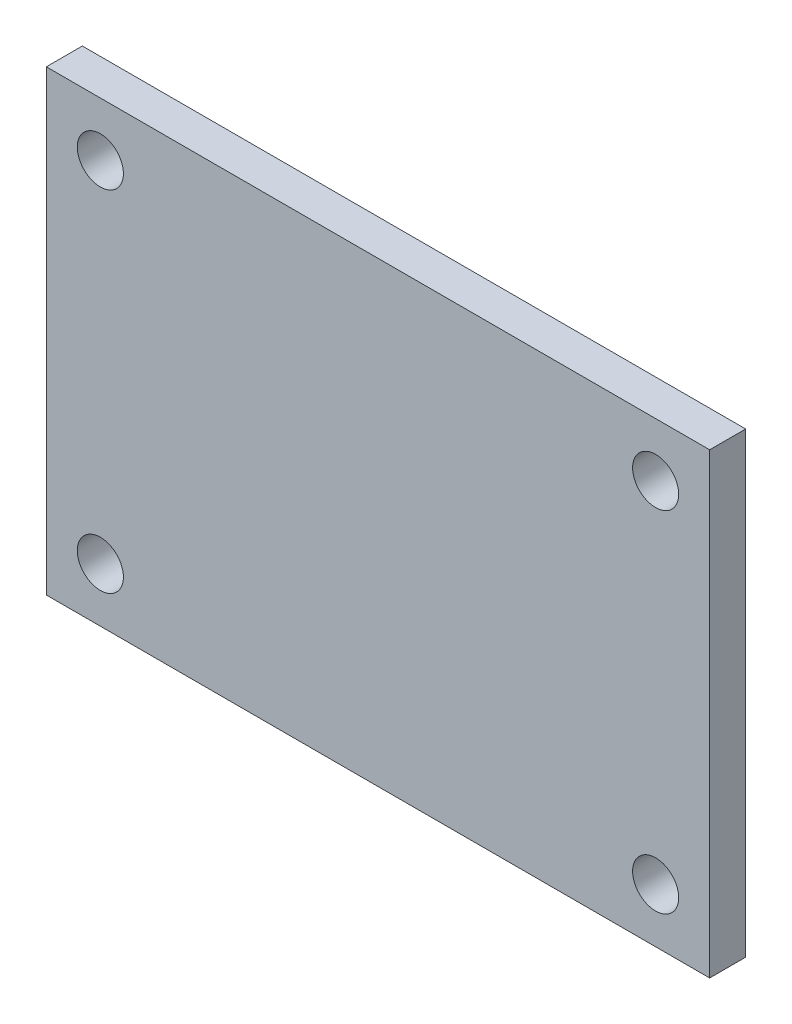
ISO-10303-21;
HEADER;
FILE_DESCRIPTION(('STEP AP214'),'2;1');
FILE_NAME('part.step','',(''),(''),'','','');
FILE_SCHEMA(('AUTOMOTIVE_DESIGN { 1 0 10303 214 1 1 1 1 }'));
ENDSEC;
DATA;
#1=APPLICATION_CONTEXT('core data for automotive mechanical design processes');
#2=APPLICATION_PROTOCOL_DEFINITION('international standard','automotive_design',2000,#1);
#3=PRODUCT_CONTEXT('',#1,'mechanical');
#4=PRODUCT('Part','Part','',(#3));
#5=PRODUCT_RELATED_PRODUCT_CATEGORY('part','',(#4));
#6=PRODUCT_DEFINITION_FORMATION('','',#4);
#7=PRODUCT_DEFINITION_CONTEXT('part definition',#1,'design');
#8=PRODUCT_DEFINITION('design','',#6,#7);
#9=PRODUCT_DEFINITION_SHAPE('','',#8);
#10=(LENGTH_UNIT() NAMED_UNIT(*) SI_UNIT(.MILLI.,.METRE.));
#11=(NAMED_UNIT(*) PLANE_ANGLE_UNIT() SI_UNIT($,.RADIAN.));
#12=(NAMED_UNIT(*) SI_UNIT($,.STERADIAN.) SOLID_ANGLE_UNIT());
#13=UNCERTAINTY_MEASURE_WITH_UNIT(LENGTH_MEASURE(1.E-05),#10,'distance_accuracy_value','');
#14=(GEOMETRIC_REPRESENTATION_CONTEXT(3) GLOBAL_UNCERTAINTY_ASSIGNED_CONTEXT((#13)) GLOBAL_UNIT_ASSIGNED_CONTEXT((#10,
#11,#12)) REPRESENTATION_CONTEXT('',''));
#15=CARTESIAN_POINT('',(0.,0.,0.));
#16=DIRECTION('',(0.,0.,1.));
#17=DIRECTION('',(1.,0.,0.));
#18=AXIS2_PLACEMENT_3D('',#15,#16,#17);
#19=CARTESIAN_POINT('',(0.,0.,5.));
#20=DIRECTION('',(0.,0.,1.));
#21=DIRECTION('',(1.,0.,0.));
#22=AXIS2_PLACEMENT_3D('',#19,#20,#21);
#23=PLANE('',#22);
#24=CARTESIAN_POINT('',(-7.49999999999999,-56.,5.));
#25=DIRECTION('',(0.,0.,1.));
#26=DIRECTION('',(1.,0.,0.));
#27=AXIS2_PLACEMENT_3D('',#24,#25,#26);
#28=CIRCLE('',#27,3.2);
#29=CARTESIAN_POINT('',(-4.3,-56.,5.));
#30=VERTEX_POINT('',#29);
#31=EDGE_CURVE('E121',#30,#30,#28,.T.);
#32=ORIENTED_EDGE('',*,*,#31,.F.);
#33=EDGE_LOOP('',(#32));
#34=FACE_BOUND('',#33,.T.);
#35=CARTESIAN_POINT('',(-84.58,-7.50000000000003,5.));
#36=DIRECTION('',(0.,0.,1.));
#37=DIRECTION('',(1.,0.,0.));
#38=AXIS2_PLACEMENT_3D('',#35,#36,#37);
#39=CIRCLE('',#38,3.2);
#40=CARTESIAN_POINT('',(-81.38,-7.50000000000003,5.));
#41=VERTEX_POINT('',#40);
#42=EDGE_CURVE('E100',#41,#41,#39,.T.);
#43=ORIENTED_EDGE('',*,*,#42,.F.);
#44=EDGE_LOOP('',(#43));
#45=FACE_BOUND('',#44,.T.);
#46=DIRECTION('',(0.,1.,0.));
#47=VECTOR('',#46,1.);
#48=CARTESIAN_POINT('',(0.,-63.5,5.));
#49=LINE('',#48,#47);
#50=CARTESIAN_POINT('',(0.,-63.5,5.));
#51=VERTEX_POINT('',#50);
#52=CARTESIAN_POINT('',(0.,0.,5.));
#53=VERTEX_POINT('',#52);
#54=EDGE_CURVE('E85',#51,#53,#49,.T.);
#55=ORIENTED_EDGE('',*,*,#54,.T.);
#56=DIRECTION('',(-1.,0.,0.));
#57=VECTOR('',#56,1.);
#58=CARTESIAN_POINT('',(0.,0.,5.));
#59=LINE('',#58,#57);
#60=CARTESIAN_POINT('',(-92.08,0.,5.));
#61=VERTEX_POINT('',#60);
#62=EDGE_CURVE('E80',#53,#61,#59,.T.);
#63=ORIENTED_EDGE('',*,*,#62,.T.);
#64=DIRECTION('',(0.,-1.,0.));
#65=VECTOR('',#64,1.);
#66=CARTESIAN_POINT('',(-92.08,0.,5.));
#67=LINE('',#66,#65);
#68=CARTESIAN_POINT('',(-92.08,-63.5,5.));
#69=VERTEX_POINT('',#68);
#70=EDGE_CURVE('E83',#61,#69,#67,.T.);
#71=ORIENTED_EDGE('',*,*,#70,.T.);
#72=DIRECTION('',(1.,0.,0.));
#73=VECTOR('',#72,1.);
#74=CARTESIAN_POINT('',(-92.08,-63.5,5.));
#75=LINE('',#74,#73);
#76=EDGE_CURVE('E50',#69,#51,#75,.T.);
#77=ORIENTED_EDGE('',*,*,#76,.T.);
#78=EDGE_LOOP('',(#55,#63,#71,#77));
#79=FACE_BOUND('',#78,.T.);
#80=CARTESIAN_POINT('',(-7.50000000000001,-7.5,5.));
#81=DIRECTION('',(0.,0.,1.));
#82=DIRECTION('',(1.,0.,0.));
#83=AXIS2_PLACEMENT_3D('',#80,#81,#82);
#84=CIRCLE('',#83,3.2);
#85=CARTESIAN_POINT('',(-4.30000000000001,-7.5,5.));
#86=VERTEX_POINT('',#85);
#87=EDGE_CURVE('E115',#86,#86,#84,.T.);
#88=ORIENTED_EDGE('',*,*,#87,.F.);
#89=EDGE_LOOP('',(#88));
#90=FACE_BOUND('',#89,.T.);
#91=CARTESIAN_POINT('',(-84.58,-56.,5.));
#92=DIRECTION('',(0.,0.,1.));
#93=DIRECTION('',(1.,0.,0.));
#94=AXIS2_PLACEMENT_3D('',#91,#92,#93);
#95=CIRCLE('',#94,3.20000000000001);
#96=CARTESIAN_POINT('',(-81.38,-56.,5.));
#97=VERTEX_POINT('',#96);
#98=EDGE_CURVE('E127',#97,#97,#95,.T.);
#99=ORIENTED_EDGE('',*,*,#98,.F.);
#100=EDGE_LOOP('',(#99));
#101=FACE_BOUND('',#100,.T.);
#102=ADVANCED_FACE('F33',(#34,#45,#79,#90,#101),#23,.T.);
#103=CARTESIAN_POINT('',(0.,0.,0.));
#104=DIRECTION('',(0.,0.,1.));
#105=DIRECTION('',(1.,0.,0.));
#106=AXIS2_PLACEMENT_3D('',#103,#104,#105);
#107=PLANE('',#106);
#108=DIRECTION('',(0.,1.,0.));
#109=VECTOR('',#108,1.);
#110=CARTESIAN_POINT('',(0.,-63.5,0.));
#111=LINE('',#110,#109);
#112=CARTESIAN_POINT('',(0.,-63.5,0.));
#113=VERTEX_POINT('',#112);
#114=CARTESIAN_POINT('',(0.,0.,0.));
#115=VERTEX_POINT('',#114);
#116=EDGE_CURVE('E97',#113,#115,#111,.T.);
#117=ORIENTED_EDGE('',*,*,#116,.F.);
#118=DIRECTION('',(1.,0.,0.));
#119=VECTOR('',#118,1.);
#120=CARTESIAN_POINT('',(-92.08,-63.5,0.));
#121=LINE('',#120,#119);
#122=CARTESIAN_POINT('',(-92.08,-63.5,0.));
#123=VERTEX_POINT('',#122);
#124=EDGE_CURVE('E73',#123,#113,#121,.T.);
#125=ORIENTED_EDGE('',*,*,#124,.F.);
#126=DIRECTION('',(0.,-1.,0.));
#127=VECTOR('',#126,1.);
#128=CARTESIAN_POINT('',(-92.08,0.,0.));
#129=LINE('',#128,#127);
#130=CARTESIAN_POINT('',(-92.08,0.,0.));
#131=VERTEX_POINT('',#130);
#132=EDGE_CURVE('E67',#131,#123,#129,.T.);
#133=ORIENTED_EDGE('',*,*,#132,.F.);
#134=DIRECTION('',(-1.,0.,0.));
#135=VECTOR('',#134,1.);
#136=CARTESIAN_POINT('',(0.,0.,0.));
#137=LINE('',#136,#135);
#138=EDGE_CURVE('E89',#115,#131,#137,.T.);
#139=ORIENTED_EDGE('',*,*,#138,.F.);
#140=EDGE_LOOP('',(#117,#125,#133,#139));
#141=FACE_BOUND('',#140,.T.);
#142=CARTESIAN_POINT('',(-84.58,-7.50000000000003,0.));
#143=DIRECTION('',(0.,0.,1.));
#144=DIRECTION('',(1.,0.,0.));
#145=AXIS2_PLACEMENT_3D('',#142,#143,#144);
#146=CIRCLE('',#145,3.2);
#147=CARTESIAN_POINT('',(-81.38,-7.50000000000003,0.));
#148=VERTEX_POINT('',#147);
#149=EDGE_CURVE('E112',#148,#148,#146,.T.);
#150=ORIENTED_EDGE('',*,*,#149,.T.);
#151=EDGE_LOOP('',(#150));
#152=FACE_BOUND('',#151,.T.);
#153=CARTESIAN_POINT('',(-7.50000000000001,-7.5,0.));
#154=DIRECTION('',(0.,0.,1.));
#155=DIRECTION('',(1.,0.,0.));
#156=AXIS2_PLACEMENT_3D('',#153,#154,#155);
#157=CIRCLE('',#156,3.2);
#158=CARTESIAN_POINT('',(-4.30000000000001,-7.5,0.));
#159=VERTEX_POINT('',#158);
#160=EDGE_CURVE('E118',#159,#159,#157,.T.);
#161=ORIENTED_EDGE('',*,*,#160,.T.);
#162=EDGE_LOOP('',(#161));
#163=FACE_BOUND('',#162,.T.);
#164=CARTESIAN_POINT('',(-7.49999999999999,-56.,0.));
#165=DIRECTION('',(0.,0.,1.));
#166=DIRECTION('',(1.,0.,0.));
#167=AXIS2_PLACEMENT_3D('',#164,#165,#166);
#168=CIRCLE('',#167,3.2);
#169=CARTESIAN_POINT('',(-4.3,-56.,0.));
#170=VERTEX_POINT('',#169);
#171=EDGE_CURVE('E124',#170,#170,#168,.T.);
#172=ORIENTED_EDGE('',*,*,#171,.T.);
#173=EDGE_LOOP('',(#172));
#174=FACE_BOUND('',#173,.T.);
#175=CARTESIAN_POINT('',(-84.58,-56.,0.));
#176=DIRECTION('',(0.,0.,1.));
#177=DIRECTION('',(1.,0.,0.));
#178=AXIS2_PLACEMENT_3D('',#175,#176,#177);
#179=CIRCLE('',#178,3.20000000000001);
#180=CARTESIAN_POINT('',(-81.38,-56.,0.));
#181=VERTEX_POINT('',#180);
#182=EDGE_CURVE('E130',#181,#181,#179,.T.);
#183=ORIENTED_EDGE('',*,*,#182,.T.);
#184=EDGE_LOOP('',(#183));
#185=FACE_BOUND('',#184,.T.);
#186=ADVANCED_FACE('F108',(#141,#152,#163,#174,#185),#107,.F.);
#187=CARTESIAN_POINT('',(0.,-63.5,5.));
#188=DIRECTION('',(-1.,0.,0.));
#189=DIRECTION('',(0.,0.,1.));
#190=AXIS2_PLACEMENT_3D('',#187,#188,#189);
#191=PLANE('',#190);
#192=ORIENTED_EDGE('',*,*,#116,.T.);
#193=DIRECTION('',(0.,0.,-1.));
#194=VECTOR('',#193,1.);
#195=CARTESIAN_POINT('',(0.,0.,5.));
#196=LINE('',#195,#194);
#197=EDGE_CURVE('E11',#53,#115,#196,.T.);
#198=ORIENTED_EDGE('',*,*,#197,.F.);
#199=ORIENTED_EDGE('',*,*,#54,.F.);
#200=DIRECTION('',(0.,0.,-1.));
#201=VECTOR('',#200,1.);
#202=CARTESIAN_POINT('',(0.,-63.5,5.));
#203=LINE('',#202,#201);
#204=EDGE_CURVE('E93',#51,#113,#203,.T.);
#205=ORIENTED_EDGE('',*,*,#204,.T.);
#206=EDGE_LOOP('',(#192,#198,#199,#205));
#207=FACE_BOUND('',#206,.T.);
#208=ADVANCED_FACE('F35',(#207),#191,.F.);
#209=CARTESIAN_POINT('',(0.,0.,5.));
#210=DIRECTION('',(0.,-1.,0.));
#211=DIRECTION('',(1.,0.,0.));
#212=AXIS2_PLACEMENT_3D('',#209,#210,#211);
#213=PLANE('',#212);
#214=ORIENTED_EDGE('',*,*,#138,.T.);
#215=DIRECTION('',(0.,0.,-1.));
#216=VECTOR('',#215,1.);
#217=CARTESIAN_POINT('',(-92.08,0.,5.));
#218=LINE('',#217,#216);
#219=EDGE_CURVE('E42',#61,#131,#218,.T.);
#220=ORIENTED_EDGE('',*,*,#219,.F.);
#221=ORIENTED_EDGE('',*,*,#62,.F.);
#222=ORIENTED_EDGE('',*,*,#197,.T.);
#223=EDGE_LOOP('',(#214,#220,#221,#222));
#224=FACE_BOUND('',#223,.T.);
#225=ADVANCED_FACE('F88',(#224),#213,.F.);
#226=CARTESIAN_POINT('',(-92.08,0.,5.));
#227=DIRECTION('',(1.,0.,0.));
#228=DIRECTION('',(0.,1.,0.));
#229=AXIS2_PLACEMENT_3D('',#226,#227,#228);
#230=PLANE('',#229);
#231=ORIENTED_EDGE('',*,*,#132,.T.);
#232=DIRECTION('',(0.,0.,-1.));
#233=VECTOR('',#232,1.);
#234=CARTESIAN_POINT('',(-92.08,-63.5,5.));
#235=LINE('',#234,#233);
#236=EDGE_CURVE('E90',#69,#123,#235,.T.);
#237=ORIENTED_EDGE('',*,*,#236,.F.);
#238=ORIENTED_EDGE('',*,*,#70,.F.);
#239=ORIENTED_EDGE('',*,*,#219,.T.);
#240=EDGE_LOOP('',(#231,#237,#238,#239));
#241=FACE_BOUND('',#240,.T.);
#242=ADVANCED_FACE('F91',(#241),#230,.F.);
#243=CARTESIAN_POINT('',(-92.08,-63.5,5.));
#244=DIRECTION('',(0.,1.,0.));
#245=DIRECTION('',(0.,0.,1.));
#246=AXIS2_PLACEMENT_3D('',#243,#244,#245);
#247=PLANE('',#246);
#248=ORIENTED_EDGE('',*,*,#124,.T.);
#249=ORIENTED_EDGE('',*,*,#204,.F.);
#250=ORIENTED_EDGE('',*,*,#76,.F.);
#251=ORIENTED_EDGE('',*,*,#236,.T.);
#252=EDGE_LOOP('',(#248,#249,#250,#251));
#253=FACE_BOUND('',#252,.T.);
#254=ADVANCED_FACE('F105',(#253),#247,.F.);
#255=CARTESIAN_POINT('',(-84.58,-7.50000000000003,5.));
#256=DIRECTION('',(0.,0.,-1.));
#257=DIRECTION('',(-1.,0.,0.));
#258=AXIS2_PLACEMENT_3D('',#255,#256,#257);
#259=CYLINDRICAL_SURFACE('',#258,3.2);
#260=ORIENTED_EDGE('',*,*,#42,.T.);
#261=EDGE_LOOP('',(#260));
#262=FACE_BOUND('',#261,.T.);
#263=ORIENTED_EDGE('',*,*,#149,.F.);
#264=EDGE_LOOP('',(#263));
#265=FACE_BOUND('',#264,.T.);
#266=ADVANCED_FACE('F149',(#262,#265),#259,.F.);
#267=CARTESIAN_POINT('',(-7.50000000000001,-7.5,5.));
#268=DIRECTION('',(0.,0.,-1.));
#269=DIRECTION('',(-1.,0.,0.));
#270=AXIS2_PLACEMENT_3D('',#267,#268,#269);
#271=CYLINDRICAL_SURFACE('',#270,3.2);
#272=ORIENTED_EDGE('',*,*,#87,.T.);
#273=EDGE_LOOP('',(#272));
#274=FACE_BOUND('',#273,.T.);
#275=ORIENTED_EDGE('',*,*,#160,.F.);
#276=EDGE_LOOP('',(#275));
#277=FACE_BOUND('',#276,.T.);
#278=ADVANCED_FACE('F195',(#274,#277),#271,.F.);
#279=CARTESIAN_POINT('',(-7.49999999999999,-56.,5.));
#280=DIRECTION('',(0.,0.,-1.));
#281=DIRECTION('',(-1.,0.,0.));
#282=AXIS2_PLACEMENT_3D('',#279,#280,#281);
#283=CYLINDRICAL_SURFACE('',#282,3.2);
#284=ORIENTED_EDGE('',*,*,#31,.T.);
#285=EDGE_LOOP('',(#284));
#286=FACE_BOUND('',#285,.T.);
#287=ORIENTED_EDGE('',*,*,#171,.F.);
#288=EDGE_LOOP('',(#287));
#289=FACE_BOUND('',#288,.T.);
#290=ADVANCED_FACE('F203',(#286,#289),#283,.F.);
#291=CARTESIAN_POINT('',(-84.58,-56.,5.));
#292=DIRECTION('',(0.,0.,-1.));
#293=DIRECTION('',(-1.,0.,0.));
#294=AXIS2_PLACEMENT_3D('',#291,#292,#293);
#295=CYLINDRICAL_SURFACE('',#294,3.20000000000001);
#296=ORIENTED_EDGE('',*,*,#98,.T.);
#297=EDGE_LOOP('',(#296));
#298=FACE_BOUND('',#297,.T.);
#299=ORIENTED_EDGE('',*,*,#182,.F.);
#300=EDGE_LOOP('',(#299));
#301=FACE_BOUND('',#300,.T.);
#302=ADVANCED_FACE('F136',(#298,#301),#295,.F.);
#303=CLOSED_SHELL('',(#102,#186,#208,#225,#242,#254,#266,#278,#290,#302));
#304=MANIFOLD_SOLID_BREP('B2',#303);
#305=ADVANCED_BREP_SHAPE_REPRESENTATION('',(#18,#304),#14);
#306=SHAPE_DEFINITION_REPRESENTATION(#9,#305);
ENDSEC;
END-ISO-10303-21;
